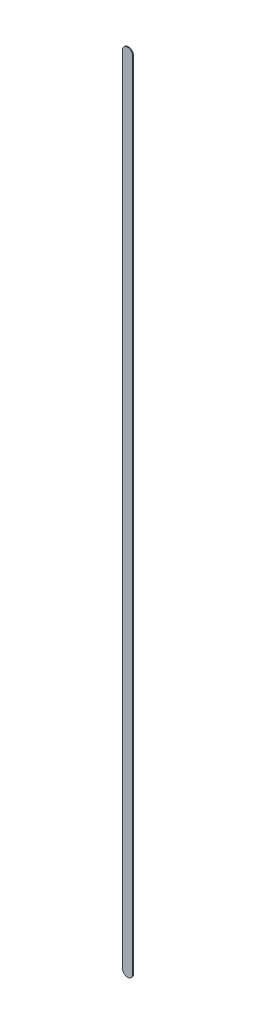
ISO-10303-21;
HEADER;
FILE_DESCRIPTION(('STEP AP214'),'2;1');
FILE_NAME('part.step','',(''),(''),'','','');
FILE_SCHEMA(('AUTOMOTIVE_DESIGN { 1 0 10303 214 1 1 1 1 }'));
ENDSEC;
DATA;
#1=APPLICATION_CONTEXT('core data for automotive mechanical design processes');
#2=APPLICATION_PROTOCOL_DEFINITION('international standard','automotive_design',2000,#1);
#3=PRODUCT_CONTEXT('',#1,'mechanical');
#4=PRODUCT('Part','Part','',(#3));
#5=PRODUCT_RELATED_PRODUCT_CATEGORY('part','',(#4));
#6=PRODUCT_DEFINITION_FORMATION('','',#4);
#7=PRODUCT_DEFINITION_CONTEXT('part definition',#1,'design');
#8=PRODUCT_DEFINITION('design','',#6,#7);
#9=PRODUCT_DEFINITION_SHAPE('','',#8);
#10=(LENGTH_UNIT() NAMED_UNIT(*) SI_UNIT(.MILLI.,.METRE.));
#11=(NAMED_UNIT(*) PLANE_ANGLE_UNIT() SI_UNIT($,.RADIAN.));
#12=(NAMED_UNIT(*) SI_UNIT($,.STERADIAN.) SOLID_ANGLE_UNIT());
#13=UNCERTAINTY_MEASURE_WITH_UNIT(LENGTH_MEASURE(1.E-05),#10,'distance_accuracy_value','');
#14=(GEOMETRIC_REPRESENTATION_CONTEXT(3) GLOBAL_UNCERTAINTY_ASSIGNED_CONTEXT((#13)) GLOBAL_UNIT_ASSIGNED_CONTEXT((#10,
#11,#12)) REPRESENTATION_CONTEXT('',''));
#15=CARTESIAN_POINT('',(0.,0.,0.));
#16=DIRECTION('',(0.,0.,1.));
#17=DIRECTION('',(1.,0.,0.));
#18=AXIS2_PLACEMENT_3D('',#15,#16,#17);
#19=CARTESIAN_POINT('',(20.375,49.4125,1.1723000001));
#20=DIRECTION('',(0.,0.,1.));
#21=DIRECTION('',(1.,0.,0.));
#22=AXIS2_PLACEMENT_3D('',#19,#20,#21);
#23=PLANE('',#22);
#24=CARTESIAN_POINT('',(20.375,43.6625,1.1723000001));
#25=DIRECTION('',(0.,0.,-1.));
#26=DIRECTION('',(1.,0.,0.));
#27=AXIS2_PLACEMENT_3D('',#24,#25,#26);
#28=CIRCLE('',#27,0.075);
#29=CARTESIAN_POINT('',(20.45,43.6625,1.1723000001));
#30=VERTEX_POINT('',#29);
#31=CARTESIAN_POINT('',(20.3,43.6625,1.1723000001));
#32=VERTEX_POINT('',#31);
#33=EDGE_CURVE('E47',#30,#32,#28,.T.);
#34=ORIENTED_EDGE('',*,*,#33,.F.);
#35=DIRECTION('',(0.,1.,0.));
#36=VECTOR('',#35,1.);
#37=CARTESIAN_POINT('',(20.45,55.1625,1.1723000001));
#38=LINE('',#37,#36);
#39=CARTESIAN_POINT('',(20.45,55.1625,1.1723000001));
#40=VERTEX_POINT('',#39);
#41=EDGE_CURVE('E79',#30,#40,#38,.T.);
#42=ORIENTED_EDGE('',*,*,#41,.T.);
#43=CARTESIAN_POINT('',(20.375,55.1625,1.1723000001));
#44=DIRECTION('',(0.,0.,1.));
#45=DIRECTION('',(1.,0.,0.));
#46=AXIS2_PLACEMENT_3D('',#43,#44,#45);
#47=CIRCLE('',#46,0.075);
#48=CARTESIAN_POINT('',(20.3,55.1625,1.1723000001));
#49=VERTEX_POINT('',#48);
#50=EDGE_CURVE('E123',#40,#49,#47,.T.);
#51=ORIENTED_EDGE('',*,*,#50,.T.);
#52=DIRECTION('',(0.,-1.,0.));
#53=VECTOR('',#52,1.);
#54=CARTESIAN_POINT('',(20.3,43.6625,1.1723000001));
#55=LINE('',#54,#53);
#56=EDGE_CURVE('E11',#49,#32,#55,.T.);
#57=ORIENTED_EDGE('',*,*,#56,.T.);
#58=EDGE_LOOP('',(#34,#42,#51,#57));
#59=FACE_BOUND('',#58,.T.);
#60=ADVANCED_FACE('F17',(#59),#23,.T.);
#61=CARTESIAN_POINT('',(20.3,43.6625,1.1596000001));
#62=DIRECTION('',(1.,0.,0.));
#63=DIRECTION('',(0.,1.,0.));
#64=AXIS2_PLACEMENT_3D('',#61,#62,#63);
#65=PLANE('',#64);
#66=DIRECTION('',(0.,0.,1.));
#67=VECTOR('',#66,1.);
#68=CARTESIAN_POINT('',(20.3,55.1625,1.1596000001));
#69=LINE('',#68,#67);
#70=CARTESIAN_POINT('',(20.3,55.1625,1.1596000001));
#71=VERTEX_POINT('',#70);
#72=EDGE_CURVE('E117',#71,#49,#69,.T.);
#73=ORIENTED_EDGE('',*,*,#72,.F.);
#74=DIRECTION('',(0.,-1.,0.));
#75=VECTOR('',#74,1.);
#76=CARTESIAN_POINT('',(20.3,49.4125,1.1596000001));
#77=LINE('',#76,#75);
#78=CARTESIAN_POINT('',(20.3,43.6625,1.1596000001));
#79=VERTEX_POINT('',#78);
#80=EDGE_CURVE('E89',#71,#79,#77,.T.);
#81=ORIENTED_EDGE('',*,*,#80,.T.);
#82=DIRECTION('',(0.,0.,-1.));
#83=VECTOR('',#82,1.);
#84=CARTESIAN_POINT('',(20.3,43.6625,1.1596000001));
#85=LINE('',#84,#83);
#86=EDGE_CURVE('E27',#32,#79,#85,.T.);
#87=ORIENTED_EDGE('',*,*,#86,.F.);
#88=ORIENTED_EDGE('',*,*,#56,.F.);
#89=EDGE_LOOP('',(#73,#81,#87,#88));
#90=FACE_BOUND('',#89,.T.);
#91=ADVANCED_FACE('F183',(#90),#65,.F.);
#92=CARTESIAN_POINT('',(20.375,43.6625,1.1596000001));
#93=DIRECTION('',(0.,0.,1.));
#94=DIRECTION('',(1.,0.,0.));
#95=AXIS2_PLACEMENT_3D('',#92,#93,#94);
#96=CYLINDRICAL_SURFACE('',#95,0.075);
#97=CARTESIAN_POINT('',(20.375,43.6625,1.1596000001));
#98=DIRECTION('',(0.,0.,1.));
#99=DIRECTION('',(1.,0.,0.));
#100=AXIS2_PLACEMENT_3D('',#97,#98,#99);
#101=CIRCLE('',#100,0.075);
#102=CARTESIAN_POINT('',(20.45,43.6625,1.1596000001));
#103=VERTEX_POINT('',#102);
#104=EDGE_CURVE('E84',#79,#103,#101,.T.);
#105=ORIENTED_EDGE('',*,*,#104,.T.);
#106=DIRECTION('',(0.,0.,1.));
#107=VECTOR('',#106,1.);
#108=CARTESIAN_POINT('',(20.45,43.6625,1.1596000001));
#109=LINE('',#108,#107);
#110=EDGE_CURVE('E75',#103,#30,#109,.T.);
#111=ORIENTED_EDGE('',*,*,#110,.T.);
#112=ORIENTED_EDGE('',*,*,#33,.T.);
#113=ORIENTED_EDGE('',*,*,#86,.T.);
#114=EDGE_LOOP('',(#105,#111,#112,#113));
#115=FACE_BOUND('',#114,.T.);
#116=ADVANCED_FACE('F19',(#115),#96,.T.);
#117=CARTESIAN_POINT('',(20.45,55.1625,1.1596000001));
#118=DIRECTION('',(-1.,0.,0.));
#119=DIRECTION('',(0.,0.,1.));
#120=AXIS2_PLACEMENT_3D('',#117,#118,#119);
#121=PLANE('',#120);
#122=ORIENTED_EDGE('',*,*,#110,.F.);
#123=DIRECTION('',(0.,1.,0.));
#124=VECTOR('',#123,1.);
#125=CARTESIAN_POINT('',(20.45,49.4125,1.1596000001));
#126=LINE('',#125,#124);
#127=CARTESIAN_POINT('',(20.45,55.1625,1.1596000001));
#128=VERTEX_POINT('',#127);
#129=EDGE_CURVE('E21',#103,#128,#126,.T.);
#130=ORIENTED_EDGE('',*,*,#129,.T.);
#131=DIRECTION('',(0.,0.,-1.));
#132=VECTOR('',#131,1.);
#133=CARTESIAN_POINT('',(20.45,55.1625,1.1596000001));
#134=LINE('',#133,#132);
#135=EDGE_CURVE('E63',#40,#128,#134,.T.);
#136=ORIENTED_EDGE('',*,*,#135,.F.);
#137=ORIENTED_EDGE('',*,*,#41,.F.);
#138=EDGE_LOOP('',(#122,#130,#136,#137));
#139=FACE_BOUND('',#138,.T.);
#140=ADVANCED_FACE('F77',(#139),#121,.F.);
#141=CARTESIAN_POINT('',(20.375,55.1625,1.1596000001));
#142=DIRECTION('',(0.,0.,1.));
#143=DIRECTION('',(1.,0.,0.));
#144=AXIS2_PLACEMENT_3D('',#141,#142,#143);
#145=CYLINDRICAL_SURFACE('',#144,0.075);
#146=CARTESIAN_POINT('',(20.375,55.1625,1.1596000001));
#147=DIRECTION('',(0.,0.,1.));
#148=DIRECTION('',(1.,0.,0.));
#149=AXIS2_PLACEMENT_3D('',#146,#147,#148);
#150=CIRCLE('',#149,0.075);
#151=EDGE_CURVE('E92',#128,#71,#150,.T.);
#152=ORIENTED_EDGE('',*,*,#151,.T.);
#153=ORIENTED_EDGE('',*,*,#72,.T.);
#154=ORIENTED_EDGE('',*,*,#50,.F.);
#155=ORIENTED_EDGE('',*,*,#135,.T.);
#156=EDGE_LOOP('',(#152,#153,#154,#155));
#157=FACE_BOUND('',#156,.T.);
#158=ADVANCED_FACE('F157',(#157),#145,.T.);
#159=CARTESIAN_POINT('',(20.375,49.4125,1.1596000001));
#160=DIRECTION('',(0.,0.,1.));
#161=DIRECTION('',(1.,0.,0.));
#162=AXIS2_PLACEMENT_3D('',#159,#160,#161);
#163=PLANE('',#162);
#164=ORIENTED_EDGE('',*,*,#129,.F.);
#165=ORIENTED_EDGE('',*,*,#104,.F.);
#166=ORIENTED_EDGE('',*,*,#80,.F.);
#167=ORIENTED_EDGE('',*,*,#151,.F.);
#168=EDGE_LOOP('',(#164,#165,#166,#167));
#169=FACE_BOUND('',#168,.T.);
#170=ADVANCED_FACE('F91',(#169),#163,.F.);
#171=CLOSED_SHELL('',(#60,#91,#116,#140,#158,#170));
#172=MANIFOLD_SOLID_BREP('B1',#171);
#173=ADVANCED_BREP_SHAPE_REPRESENTATION('',(#18,#172),#14);
#174=SHAPE_DEFINITION_REPRESENTATION(#9,#173);
ENDSEC;
END-ISO-10303-21;
